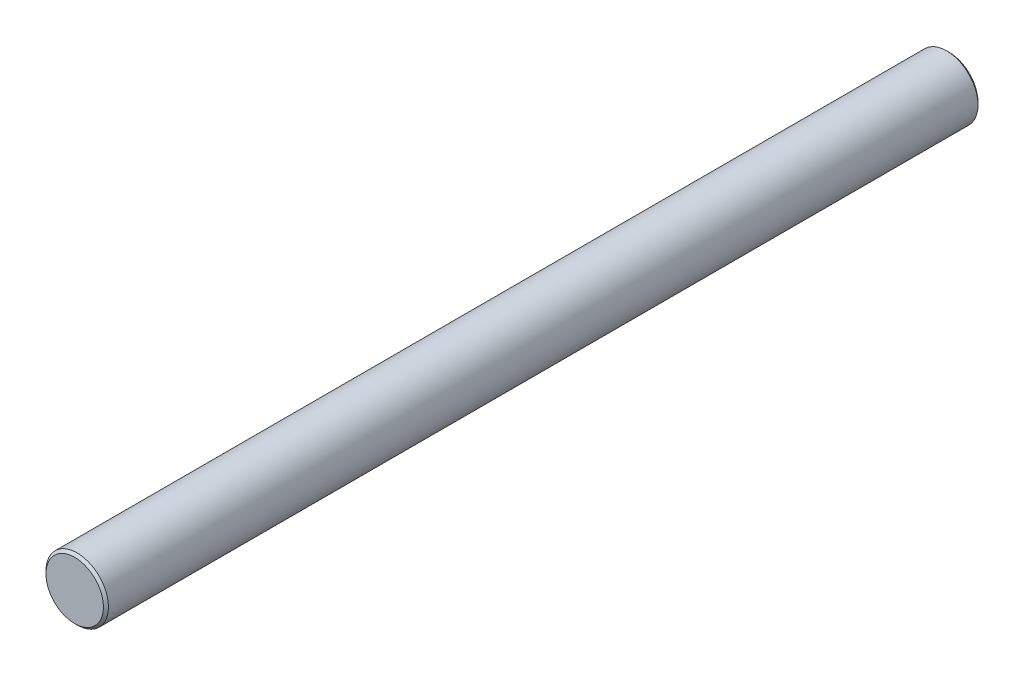
ISO-10303-21;
HEADER;
FILE_DESCRIPTION(('STEP AP214'),'2;1');
FILE_NAME('part.step','',(''),(''),'','','');
FILE_SCHEMA(('AUTOMOTIVE_DESIGN { 1 0 10303 214 1 1 1 1 }'));
ENDSEC;
DATA;
#1=APPLICATION_CONTEXT('core data for automotive mechanical design processes');
#2=APPLICATION_PROTOCOL_DEFINITION('international standard','automotive_design',2000,#1);
#3=PRODUCT_CONTEXT('',#1,'mechanical');
#4=PRODUCT('Part','Part','',(#3));
#5=PRODUCT_RELATED_PRODUCT_CATEGORY('part','',(#4));
#6=PRODUCT_DEFINITION_FORMATION('','',#4);
#7=PRODUCT_DEFINITION_CONTEXT('part definition',#1,'design');
#8=PRODUCT_DEFINITION('design','',#6,#7);
#9=PRODUCT_DEFINITION_SHAPE('','',#8);
#10=(LENGTH_UNIT() NAMED_UNIT(*) SI_UNIT(.MILLI.,.METRE.));
#11=(NAMED_UNIT(*) PLANE_ANGLE_UNIT() SI_UNIT($,.RADIAN.));
#12=(NAMED_UNIT(*) SI_UNIT($,.STERADIAN.) SOLID_ANGLE_UNIT());
#13=UNCERTAINTY_MEASURE_WITH_UNIT(LENGTH_MEASURE(1.E-05),#10,'distance_accuracy_value','');
#14=(GEOMETRIC_REPRESENTATION_CONTEXT(3) GLOBAL_UNCERTAINTY_ASSIGNED_CONTEXT((#13)) GLOBAL_UNIT_ASSIGNED_CONTEXT((#10,
#11,#12)) REPRESENTATION_CONTEXT('',''));
#15=CARTESIAN_POINT('',(0.,0.,0.));
#16=DIRECTION('',(0.,0.,1.));
#17=DIRECTION('',(1.,0.,0.));
#18=AXIS2_PLACEMENT_3D('',#15,#16,#17);
#19=CARTESIAN_POINT('',(0.,0.,140.));
#20=DIRECTION('',(0.,0.,-1.));
#21=DIRECTION('',(-1.,0.,0.));
#22=AXIS2_PLACEMENT_3D('',#19,#20,#21);
#23=CYLINDRICAL_SURFACE('',#22,5.);
#24=CARTESIAN_POINT('',(0.,0.,0.400000000000011));
#25=DIRECTION('',(0.,0.,1.));
#26=DIRECTION('',(1.,0.,0.));
#27=AXIS2_PLACEMENT_3D('',#24,#25,#26);
#28=CIRCLE('',#27,5.);
#29=CARTESIAN_POINT('',(5.,0.,0.400000000000011));
#30=VERTEX_POINT('',#29);
#31=EDGE_CURVE('E49',#30,#30,#28,.T.);
#32=ORIENTED_EDGE('',*,*,#31,.T.);
#33=EDGE_LOOP('',(#32));
#34=FACE_BOUND('',#33,.T.);
#35=CARTESIAN_POINT('',(0.,0.,139.6));
#36=DIRECTION('',(0.,0.,1.));
#37=DIRECTION('',(1.,0.,0.));
#38=AXIS2_PLACEMENT_3D('',#35,#36,#37);
#39=CIRCLE('',#38,5.);
#40=CARTESIAN_POINT('',(5.,0.,139.6));
#41=VERTEX_POINT('',#40);
#42=EDGE_CURVE('E53',#41,#41,#39,.F.);
#43=ORIENTED_EDGE('',*,*,#42,.T.);
#44=EDGE_LOOP('',(#43));
#45=FACE_BOUND('',#44,.T.);
#46=ADVANCED_FACE('F37',(#34,#45),#23,.T.);
#47=CARTESIAN_POINT('',(0.,0.,140.));
#48=DIRECTION('',(0.,0.,1.));
#49=DIRECTION('',(1.,0.,0.));
#50=AXIS2_PLACEMENT_3D('',#47,#48,#49);
#51=PLANE('',#50);
#52=CARTESIAN_POINT('',(0.,0.,140.));
#53=DIRECTION('',(0.,0.,1.));
#54=DIRECTION('',(1.,0.,0.));
#55=AXIS2_PLACEMENT_3D('',#52,#53,#54);
#56=CIRCLE('',#55,4.59999999999998);
#57=CARTESIAN_POINT('',(4.59999999999998,0.,140.));
#58=VERTEX_POINT('',#57);
#59=EDGE_CURVE('E10',#58,#58,#56,.T.);
#60=ORIENTED_EDGE('',*,*,#59,.T.);
#61=EDGE_LOOP('',(#60));
#62=FACE_BOUND('',#61,.T.);
#63=ADVANCED_FACE('F69',(#62),#51,.T.);
#64=CARTESIAN_POINT('',(0.,0.,0.));
#65=DIRECTION('',(0.,0.,1.));
#66=DIRECTION('',(1.,0.,0.));
#67=AXIS2_PLACEMENT_3D('',#64,#65,#66);
#68=PLANE('',#67);
#69=CARTESIAN_POINT('',(0.,0.,0.));
#70=DIRECTION('',(0.,0.,1.));
#71=DIRECTION('',(1.,0.,0.));
#72=AXIS2_PLACEMENT_3D('',#69,#70,#71);
#73=CIRCLE('',#72,4.59999999999998);
#74=CARTESIAN_POINT('',(4.59999999999998,0.,0.));
#75=VERTEX_POINT('',#74);
#76=EDGE_CURVE('E45',#75,#75,#73,.F.);
#77=ORIENTED_EDGE('',*,*,#76,.T.);
#78=EDGE_LOOP('',(#77));
#79=FACE_BOUND('',#78,.T.);
#80=ADVANCED_FACE('F66',(#79),#68,.F.);
#81=CARTESIAN_POINT('',(0.,0.,0.400000000000011));
#82=DIRECTION('',(0.,0.,1.));
#83=DIRECTION('',(1.,0.,0.));
#84=AXIS2_PLACEMENT_3D('',#81,#82,#83);
#85=CONICAL_SURFACE('',#84,5.,0.785398163397459);
#86=ORIENTED_EDGE('',*,*,#76,.F.);
#87=EDGE_LOOP('',(#86));
#88=FACE_BOUND('',#87,.T.);
#89=ORIENTED_EDGE('',*,*,#31,.F.);
#90=EDGE_LOOP('',(#89));
#91=FACE_BOUND('',#90,.T.);
#92=ADVANCED_FACE('F62',(#88,#91),#85,.T.);
#93=CARTESIAN_POINT('',(0.,0.,140.));
#94=DIRECTION('',(0.,0.,-1.));
#95=DIRECTION('',(-1.,0.,0.));
#96=AXIS2_PLACEMENT_3D('',#93,#94,#95);
#97=CONICAL_SURFACE('',#96,4.59999999999998,0.785398163397425);
#98=ORIENTED_EDGE('',*,*,#42,.F.);
#99=EDGE_LOOP('',(#98));
#100=FACE_BOUND('',#99,.T.);
#101=ORIENTED_EDGE('',*,*,#59,.F.);
#102=EDGE_LOOP('',(#101));
#103=FACE_BOUND('',#102,.T.);
#104=ADVANCED_FACE('F40',(#100,#103),#97,.T.);
#105=CLOSED_SHELL('',(#46,#63,#80,#92,#104));
#106=MANIFOLD_SOLID_BREP('B2',#105);
#107=ADVANCED_BREP_SHAPE_REPRESENTATION('',(#18,#106),#14);
#108=SHAPE_DEFINITION_REPRESENTATION(#9,#107);
ENDSEC;
END-ISO-10303-21;
